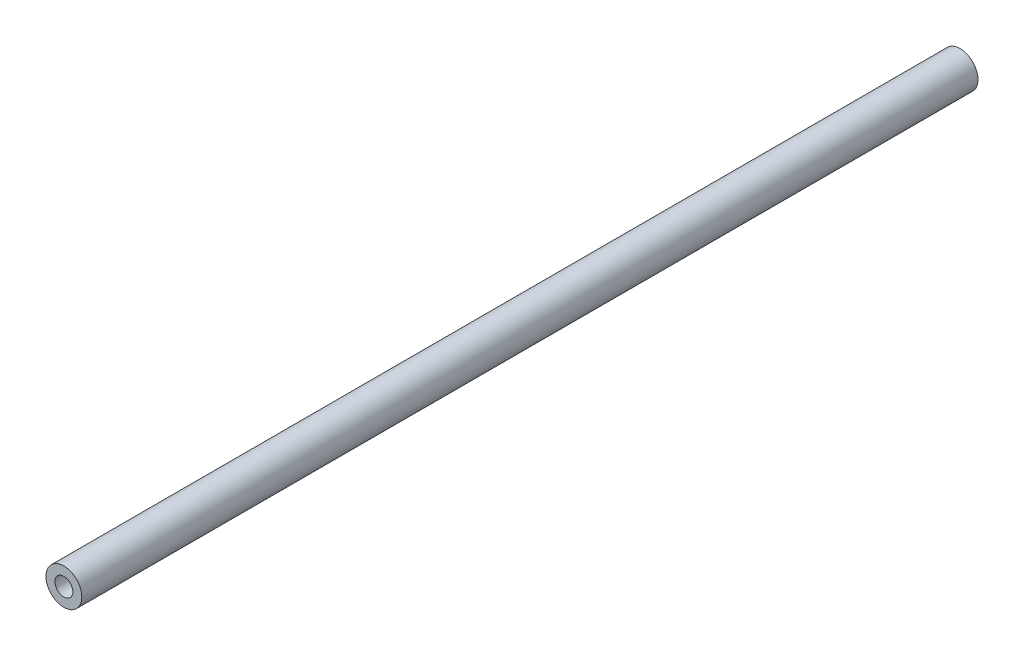
ISO-10303-21;
HEADER;
FILE_DESCRIPTION(('STEP AP214'),'2;1');
FILE_NAME('part.step','',(''),(''),'','','');
FILE_SCHEMA(('AUTOMOTIVE_DESIGN { 1 0 10303 214 1 1 1 1 }'));
ENDSEC;
DATA;
#1=APPLICATION_CONTEXT('core data for automotive mechanical design processes');
#2=APPLICATION_PROTOCOL_DEFINITION('international standard','automotive_design',2000,#1);
#3=PRODUCT_CONTEXT('',#1,'mechanical');
#4=PRODUCT('Part','Part','',(#3));
#5=PRODUCT_RELATED_PRODUCT_CATEGORY('part','',(#4));
#6=PRODUCT_DEFINITION_FORMATION('','',#4);
#7=PRODUCT_DEFINITION_CONTEXT('part definition',#1,'design');
#8=PRODUCT_DEFINITION('design','',#6,#7);
#9=PRODUCT_DEFINITION_SHAPE('','',#8);
#10=(LENGTH_UNIT() NAMED_UNIT(*) SI_UNIT(.MILLI.,.METRE.));
#11=(NAMED_UNIT(*) PLANE_ANGLE_UNIT() SI_UNIT($,.RADIAN.));
#12=(NAMED_UNIT(*) SI_UNIT($,.STERADIAN.) SOLID_ANGLE_UNIT());
#13=UNCERTAINTY_MEASURE_WITH_UNIT(LENGTH_MEASURE(1.E-05),#10,'distance_accuracy_value','');
#14=(GEOMETRIC_REPRESENTATION_CONTEXT(3) GLOBAL_UNCERTAINTY_ASSIGNED_CONTEXT((#13)) GLOBAL_UNIT_ASSIGNED_CONTEXT((#10,
#11,#12)) REPRESENTATION_CONTEXT('',''));
#15=CARTESIAN_POINT('',(0.,0.,0.));
#16=DIRECTION('',(0.,0.,1.));
#17=DIRECTION('',(1.,0.,0.));
#18=AXIS2_PLACEMENT_3D('',#15,#16,#17);
#19=CARTESIAN_POINT('',(0.,0.,100.));
#20=DIRECTION('',(0.,0.,1.));
#21=DIRECTION('',(1.,0.,0.));
#22=AXIS2_PLACEMENT_3D('',#19,#20,#21);
#23=PLANE('',#22);
#24=CARTESIAN_POINT('',(0.,0.,100.));
#25=DIRECTION('',(0.,0.,1.));
#26=DIRECTION('',(1.,0.,0.));
#27=AXIS2_PLACEMENT_3D('',#24,#25,#26);
#28=CIRCLE('',#27,4.);
#29=CARTESIAN_POINT('',(4.,0.,100.));
#30=VERTEX_POINT('',#29);
#31=EDGE_CURVE('E10',#30,#30,#28,.T.);
#32=ORIENTED_EDGE('',*,*,#31,.T.);
#33=EDGE_LOOP('',(#32));
#34=FACE_BOUND('',#33,.T.);
#35=CARTESIAN_POINT('',(0.,0.,100.));
#36=DIRECTION('',(0.,0.,1.));
#37=DIRECTION('',(1.,0.,0.));
#38=AXIS2_PLACEMENT_3D('',#35,#36,#37);
#39=CIRCLE('',#38,2.);
#40=CARTESIAN_POINT('',(2.,0.,100.));
#41=VERTEX_POINT('',#40);
#42=EDGE_CURVE('E50',#41,#41,#39,.T.);
#43=ORIENTED_EDGE('',*,*,#42,.F.);
#44=EDGE_LOOP('',(#43));
#45=FACE_BOUND('',#44,.T.);
#46=ADVANCED_FACE('F39',(#34,#45),#23,.T.);
#47=CARTESIAN_POINT('',(0.,0.,-100.));
#48=DIRECTION('',(0.,0.,1.));
#49=DIRECTION('',(1.,0.,0.));
#50=AXIS2_PLACEMENT_3D('',#47,#48,#49);
#51=PLANE('',#50);
#52=CARTESIAN_POINT('',(0.,0.,-100.));
#53=DIRECTION('',(0.,0.,1.));
#54=DIRECTION('',(1.,0.,0.));
#55=AXIS2_PLACEMENT_3D('',#52,#53,#54);
#56=CIRCLE('',#55,4.);
#57=CARTESIAN_POINT('',(4.,0.,-100.));
#58=VERTEX_POINT('',#57);
#59=EDGE_CURVE('E43',#58,#58,#56,.T.);
#60=ORIENTED_EDGE('',*,*,#59,.F.);
#61=EDGE_LOOP('',(#60));
#62=FACE_BOUND('',#61,.T.);
#63=CARTESIAN_POINT('',(0.,0.,-100.));
#64=DIRECTION('',(0.,0.,1.));
#65=DIRECTION('',(1.,0.,0.));
#66=AXIS2_PLACEMENT_3D('',#63,#64,#65);
#67=CIRCLE('',#66,2.);
#68=CARTESIAN_POINT('',(2.,0.,-100.));
#69=VERTEX_POINT('',#68);
#70=EDGE_CURVE('E52',#69,#69,#67,.T.);
#71=ORIENTED_EDGE('',*,*,#70,.T.);
#72=EDGE_LOOP('',(#71));
#73=FACE_BOUND('',#72,.T.);
#74=ADVANCED_FACE('F62',(#62,#73),#51,.F.);
#75=CARTESIAN_POINT('',(0.,0.,100.));
#76=DIRECTION('',(0.,0.,-1.));
#77=DIRECTION('',(-1.,0.,0.));
#78=AXIS2_PLACEMENT_3D('',#75,#76,#77);
#79=CYLINDRICAL_SURFACE('',#78,4.);
#80=ORIENTED_EDGE('',*,*,#31,.F.);
#81=EDGE_LOOP('',(#80));
#82=FACE_BOUND('',#81,.T.);
#83=ORIENTED_EDGE('',*,*,#59,.T.);
#84=EDGE_LOOP('',(#83));
#85=FACE_BOUND('',#84,.T.);
#86=ADVANCED_FACE('F41',(#82,#85),#79,.T.);
#87=CARTESIAN_POINT('',(0.,0.,100.));
#88=DIRECTION('',(0.,0.,-1.));
#89=DIRECTION('',(-1.,0.,0.));
#90=AXIS2_PLACEMENT_3D('',#87,#88,#89);
#91=CYLINDRICAL_SURFACE('',#90,2.);
#92=ORIENTED_EDGE('',*,*,#42,.T.);
#93=EDGE_LOOP('',(#92));
#94=FACE_BOUND('',#93,.T.);
#95=ORIENTED_EDGE('',*,*,#70,.F.);
#96=EDGE_LOOP('',(#95));
#97=FACE_BOUND('',#96,.T.);
#98=ADVANCED_FACE('F58',(#94,#97),#91,.F.);
#99=CLOSED_SHELL('',(#46,#74,#86,#98));
#100=MANIFOLD_SOLID_BREP('B2',#99);
#101=ADVANCED_BREP_SHAPE_REPRESENTATION('',(#18,#100),#14);
#102=SHAPE_DEFINITION_REPRESENTATION(#9,#101);
ENDSEC;
END-ISO-10303-21;
